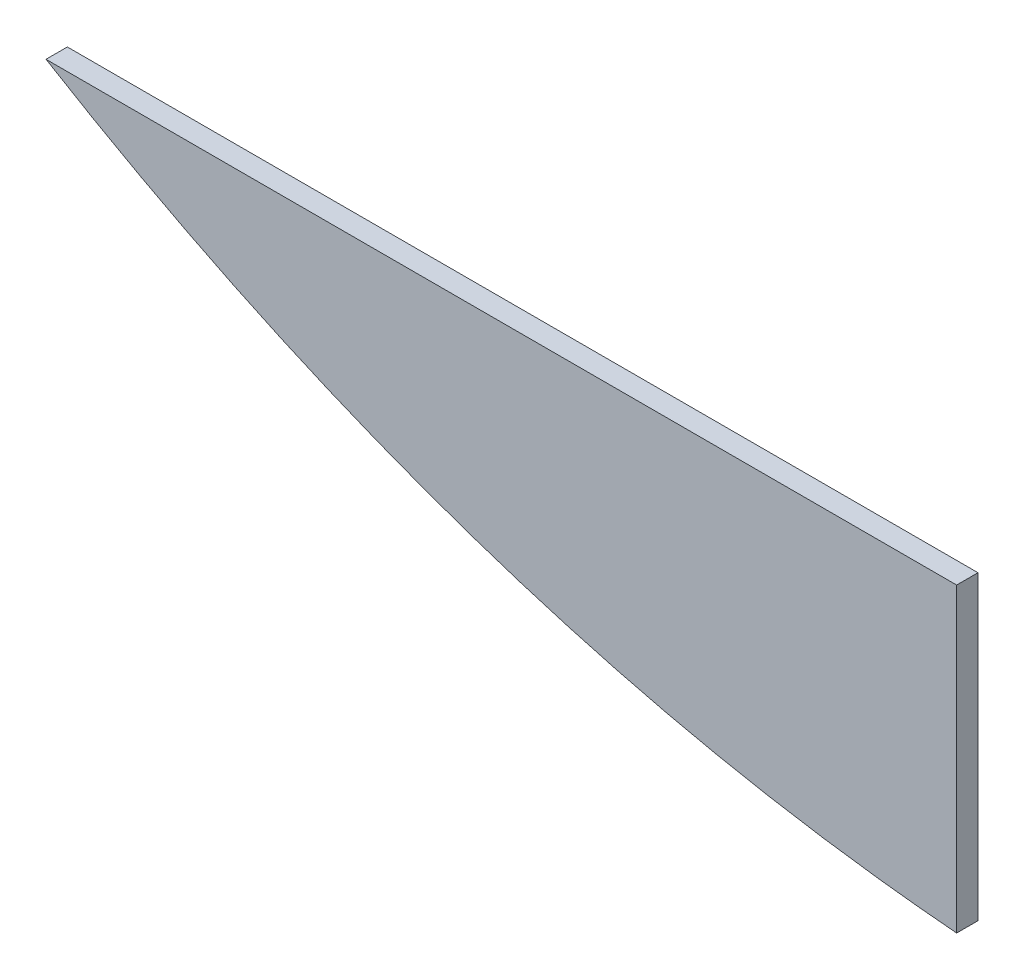
ISO-10303-21;
HEADER;
FILE_DESCRIPTION(('STEP AP214'),'2;1');
FILE_NAME('part.step','',(''),(''),'','','');
FILE_SCHEMA(('AUTOMOTIVE_DESIGN { 1 0 10303 214 1 1 1 1 }'));
ENDSEC;
DATA;
#1=APPLICATION_CONTEXT('core data for automotive mechanical design processes');
#2=APPLICATION_PROTOCOL_DEFINITION('international standard','automotive_design',2000,#1);
#3=PRODUCT_CONTEXT('',#1,'mechanical');
#4=PRODUCT('Part','Part','',(#3));
#5=PRODUCT_RELATED_PRODUCT_CATEGORY('part','',(#4));
#6=PRODUCT_DEFINITION_FORMATION('','',#4);
#7=PRODUCT_DEFINITION_CONTEXT('part definition',#1,'design');
#8=PRODUCT_DEFINITION('design','',#6,#7);
#9=PRODUCT_DEFINITION_SHAPE('','',#8);
#10=(LENGTH_UNIT() NAMED_UNIT(*) SI_UNIT(.MILLI.,.METRE.));
#11=(NAMED_UNIT(*) PLANE_ANGLE_UNIT() SI_UNIT($,.RADIAN.));
#12=(NAMED_UNIT(*) SI_UNIT($,.STERADIAN.) SOLID_ANGLE_UNIT());
#13=UNCERTAINTY_MEASURE_WITH_UNIT(LENGTH_MEASURE(1.E-05),#10,'distance_accuracy_value','');
#14=(GEOMETRIC_REPRESENTATION_CONTEXT(3) GLOBAL_UNCERTAINTY_ASSIGNED_CONTEXT((#13)) GLOBAL_UNIT_ASSIGNED_CONTEXT((#10,
#11,#12)) REPRESENTATION_CONTEXT('',''));
#15=CARTESIAN_POINT('',(0.,0.,0.));
#16=DIRECTION('',(0.,0.,1.));
#17=DIRECTION('',(1.,0.,0.));
#18=AXIS2_PLACEMENT_3D('',#15,#16,#17);
#19=CARTESIAN_POINT('',(-67.7051250497782,22.4076230544254,3.175));
#20=CARTESIAN_POINT('',(-3.36359157935304,-16.4643036415409,3.175));
#21=CARTESIAN_POINT('',(67.7051250497782,-22.4076230544255,3.175));
#22=B_SPLINE_CURVE_WITH_KNOTS('',2,(#19,#20,#21),.UNSPECIFIED.,.F.,.F.,(3,3),(0.,1.),.UNSPECIFIED.);
#23=DIRECTION('',(0.,0.,-1.));
#24=VECTOR('',#23,1.);
#25=SURFACE_OF_LINEAR_EXTRUSION('',#22,#24);
#26=CARTESIAN_POINT('',(-67.7051250497782,22.4076230544254,0.));
#27=CARTESIAN_POINT('',(-3.36359157935304,-16.4643036415409,0.));
#28=CARTESIAN_POINT('',(67.7051250497782,-22.4076230544255,0.));
#29=B_SPLINE_CURVE_WITH_KNOTS('',2,(#26,#27,#28),.UNSPECIFIED.,.F.,.F.,(3,3),(0.,1.),.UNSPECIFIED.);
#30=CARTESIAN_POINT('',(-67.7051250497782,22.4076230544254,0.));
#31=VERTEX_POINT('',#30);
#32=CARTESIAN_POINT('',(67.7051250497782,-22.4076230544255,0.));
#33=VERTEX_POINT('',#32);
#34=EDGE_CURVE('E80',#31,#33,#29,.T.);
#35=ORIENTED_EDGE('',*,*,#34,.T.);
#36=DIRECTION('',(0.,0.,-1.));
#37=VECTOR('',#36,1.);
#38=CARTESIAN_POINT('',(67.7051250497782,-22.4076230544255,3.175));
#39=LINE('',#38,#37);
#40=CARTESIAN_POINT('',(67.7051250497782,-22.4076230544255,3.175));
#41=VERTEX_POINT('',#40);
#42=EDGE_CURVE('E11',#41,#33,#39,.T.);
#43=ORIENTED_EDGE('',*,*,#42,.F.);
#44=CARTESIAN_POINT('',(-67.7051250497782,22.4076230544254,3.175));
#45=VERTEX_POINT('',#44);
#46=EDGE_CURVE('E74',#45,#41,#22,.T.);
#47=ORIENTED_EDGE('',*,*,#46,.F.);
#48=DIRECTION('',(0.,0.,-1.));
#49=VECTOR('',#48,1.);
#50=CARTESIAN_POINT('',(-67.7051250497782,22.4076230544254,3.175));
#51=LINE('',#50,#49);
#52=EDGE_CURVE('E81',#45,#31,#51,.T.);
#53=ORIENTED_EDGE('',*,*,#52,.T.);
#54=EDGE_LOOP('',(#35,#43,#47,#53));
#55=FACE_BOUND('',#54,.T.);
#56=ADVANCED_FACE('F33',(#55),#25,.F.);
#57=CARTESIAN_POINT('',(67.7051250497782,22.4076230544253,3.175));
#58=DIRECTION('',(-1.,0.,0.));
#59=DIRECTION('',(0.,0.,1.));
#60=AXIS2_PLACEMENT_3D('',#57,#58,#59);
#61=PLANE('',#60);
#62=DIRECTION('',(0.,1.,0.));
#63=VECTOR('',#62,1.);
#64=CARTESIAN_POINT('',(67.7051250497782,22.4076230544253,0.));
#65=LINE('',#64,#63);
#66=CARTESIAN_POINT('',(67.7051250497782,22.4076230544253,0.));
#67=VERTEX_POINT('',#66);
#68=EDGE_CURVE('E62',#33,#67,#65,.T.);
#69=ORIENTED_EDGE('',*,*,#68,.T.);
#70=DIRECTION('',(0.,0.,-1.));
#71=VECTOR('',#70,1.);
#72=CARTESIAN_POINT('',(67.7051250497782,22.4076230544253,3.175));
#73=LINE('',#72,#71);
#74=CARTESIAN_POINT('',(67.7051250497782,22.4076230544253,3.175));
#75=VERTEX_POINT('',#74);
#76=EDGE_CURVE('E42',#75,#67,#73,.T.);
#77=ORIENTED_EDGE('',*,*,#76,.F.);
#78=DIRECTION('',(0.,1.,0.));
#79=VECTOR('',#78,1.);
#80=CARTESIAN_POINT('',(67.7051250497782,22.4076230544253,3.175));
#81=LINE('',#80,#79);
#82=EDGE_CURVE('E70',#41,#75,#81,.T.);
#83=ORIENTED_EDGE('',*,*,#82,.F.);
#84=ORIENTED_EDGE('',*,*,#42,.T.);
#85=EDGE_LOOP('',(#69,#77,#83,#84));
#86=FACE_BOUND('',#85,.T.);
#87=ADVANCED_FACE('F71',(#86),#61,.F.);
#88=CARTESIAN_POINT('',(67.7051250497782,22.4076230544253,3.175));
#89=DIRECTION('',(0.,-1.,0.));
#90=DIRECTION('',(1.,0.,0.));
#91=AXIS2_PLACEMENT_3D('',#88,#89,#90);
#92=PLANE('',#91);
#93=DIRECTION('',(-1.,0.,0.));
#94=VECTOR('',#93,1.);
#95=CARTESIAN_POINT('',(67.7051250497782,22.4076230544253,0.));
#96=LINE('',#95,#94);
#97=EDGE_CURVE('E67',#67,#31,#96,.T.);
#98=ORIENTED_EDGE('',*,*,#97,.T.);
#99=ORIENTED_EDGE('',*,*,#52,.F.);
#100=DIRECTION('',(-1.,0.,0.));
#101=VECTOR('',#100,1.);
#102=CARTESIAN_POINT('',(67.7051250497782,22.4076230544253,3.175));
#103=LINE('',#102,#101);
#104=EDGE_CURVE('E50',#75,#45,#103,.T.);
#105=ORIENTED_EDGE('',*,*,#104,.F.);
#106=ORIENTED_EDGE('',*,*,#76,.T.);
#107=EDGE_LOOP('',(#98,#99,#105,#106));
#108=FACE_BOUND('',#107,.T.);
#109=ADVANCED_FACE('F93',(#108),#92,.F.);
#110=CARTESIAN_POINT('',(-1.68179578967652,-8.23215182077049,3.175));
#111=DIRECTION('',(0.,0.,1.));
#112=DIRECTION('',(1.,0.,0.));
#113=AXIS2_PLACEMENT_3D('',#110,#111,#112);
#114=PLANE('',#113);
#115=ORIENTED_EDGE('',*,*,#46,.T.);
#116=ORIENTED_EDGE('',*,*,#82,.T.);
#117=ORIENTED_EDGE('',*,*,#104,.T.);
#118=EDGE_LOOP('',(#115,#116,#117));
#119=FACE_BOUND('',#118,.T.);
#120=ADVANCED_FACE('F77',(#119),#114,.T.);
#121=CARTESIAN_POINT('',(-1.68179578967652,-8.23215182077049,0.));
#122=DIRECTION('',(0.,0.,1.));
#123=DIRECTION('',(1.,0.,0.));
#124=AXIS2_PLACEMENT_3D('',#121,#122,#123);
#125=PLANE('',#124);
#126=ORIENTED_EDGE('',*,*,#34,.F.);
#127=ORIENTED_EDGE('',*,*,#97,.F.);
#128=ORIENTED_EDGE('',*,*,#68,.F.);
#129=EDGE_LOOP('',(#126,#127,#128));
#130=FACE_BOUND('',#129,.T.);
#131=ADVANCED_FACE('F94',(#130),#125,.F.);
#132=CLOSED_SHELL('',(#56,#87,#109,#120,#131));
#133=MANIFOLD_SOLID_BREP('B2',#132);
#134=ADVANCED_BREP_SHAPE_REPRESENTATION('',(#18,#133),#14);
#135=SHAPE_DEFINITION_REPRESENTATION(#9,#134);
ENDSEC;
END-ISO-10303-21;
